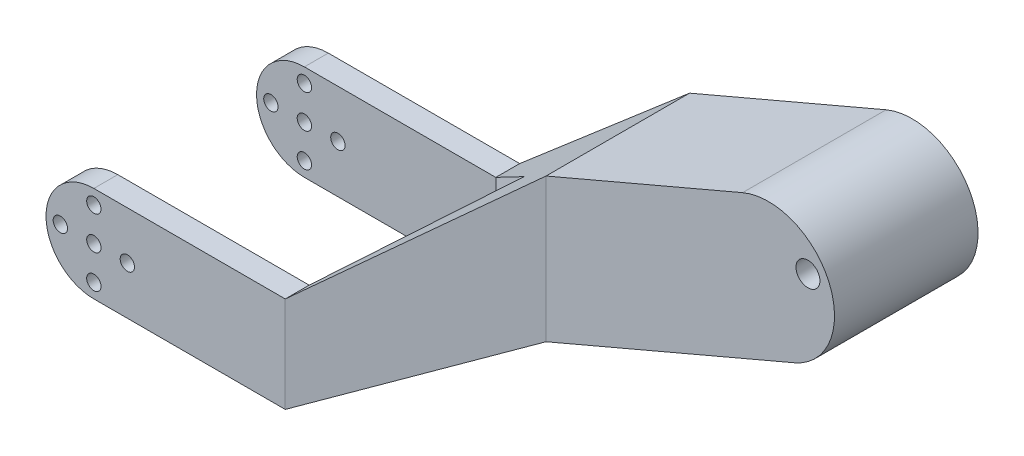
ISO-10303-21;
HEADER;
FILE_DESCRIPTION(('STEP AP214'),'2;1');
FILE_NAME('part.step','',(''),(''),'','','');
FILE_SCHEMA(('AUTOMOTIVE_DESIGN { 1 0 10303 214 1 1 1 1 }'));
ENDSEC;
DATA;
#1=APPLICATION_CONTEXT('core data for automotive mechanical design processes');
#2=APPLICATION_PROTOCOL_DEFINITION('international standard','automotive_design',2000,#1);
#3=PRODUCT_CONTEXT('',#1,'mechanical');
#4=PRODUCT('Part','Part','',(#3));
#5=PRODUCT_RELATED_PRODUCT_CATEGORY('part','',(#4));
#6=PRODUCT_DEFINITION_FORMATION('','',#4);
#7=PRODUCT_DEFINITION_CONTEXT('part definition',#1,'design');
#8=PRODUCT_DEFINITION('design','',#6,#7);
#9=PRODUCT_DEFINITION_SHAPE('','',#8);
#10=(LENGTH_UNIT() NAMED_UNIT(*) SI_UNIT(.MILLI.,.METRE.));
#11=(NAMED_UNIT(*) PLANE_ANGLE_UNIT() SI_UNIT($,.RADIAN.));
#12=(NAMED_UNIT(*) SI_UNIT($,.STERADIAN.) SOLID_ANGLE_UNIT());
#13=UNCERTAINTY_MEASURE_WITH_UNIT(LENGTH_MEASURE(1.E-05),#10,'distance_accuracy_value','');
#14=(GEOMETRIC_REPRESENTATION_CONTEXT(3) GLOBAL_UNCERTAINTY_ASSIGNED_CONTEXT((#13)) GLOBAL_UNIT_ASSIGNED_CONTEXT((#10,
#11,#12)) REPRESENTATION_CONTEXT('',''));
#15=CARTESIAN_POINT('',(0.,0.,0.));
#16=DIRECTION('',(0.,0.,1.));
#17=DIRECTION('',(1.,0.,0.));
#18=AXIS2_PLACEMENT_3D('',#15,#16,#17);
#19=CARTESIAN_POINT('',(-19.9999999999999,-7.,-44.));
#20=DIRECTION('',(0.,0.,1.));
#21=DIRECTION('',(1.,0.,0.));
#22=AXIS2_PLACEMENT_3D('',#19,#20,#21);
#23=CYLINDRICAL_SURFACE('',#22,1.5);
#24=CARTESIAN_POINT('',(-19.9999999999999,-7.,-44.));
#25=DIRECTION('',(0.,0.,-1.));
#26=DIRECTION('',(-1.,0.,0.));
#27=AXIS2_PLACEMENT_3D('',#24,#25,#26);
#28=CIRCLE('',#27,1.5);
#29=CARTESIAN_POINT('',(-21.4999999999999,-7.,-44.));
#30=VERTEX_POINT('',#29);
#31=EDGE_CURVE('E201',#30,#30,#28,.T.);
#32=ORIENTED_EDGE('',*,*,#31,.T.);
#33=EDGE_LOOP('',(#32));
#34=FACE_BOUND('',#33,.T.);
#35=CARTESIAN_POINT('',(-19.9999999999999,-7.,-39.));
#36=DIRECTION('',(0.,0.,-1.));
#37=DIRECTION('',(-1.,0.,0.));
#38=AXIS2_PLACEMENT_3D('',#35,#36,#37);
#39=CIRCLE('',#38,1.5);
#40=CARTESIAN_POINT('',(-21.4999999999999,-7.,-39.));
#41=VERTEX_POINT('',#40);
#42=EDGE_CURVE('E204',#41,#41,#39,.T.);
#43=ORIENTED_EDGE('',*,*,#42,.F.);
#44=EDGE_LOOP('',(#43));
#45=FACE_BOUND('',#44,.T.);
#46=ADVANCED_FACE('F61',(#34,#45),#23,.F.);
#47=CARTESIAN_POINT('',(-20.,7.,-44.));
#48=DIRECTION('',(0.,0.,1.));
#49=DIRECTION('',(1.,0.,0.));
#50=AXIS2_PLACEMENT_3D('',#47,#48,#49);
#51=CYLINDRICAL_SURFACE('',#50,1.5);
#52=CARTESIAN_POINT('',(-20.,7.,-44.));
#53=DIRECTION('',(0.,0.,-1.));
#54=DIRECTION('',(-1.,0.,0.));
#55=AXIS2_PLACEMENT_3D('',#52,#53,#54);
#56=CIRCLE('',#55,1.5);
#57=CARTESIAN_POINT('',(-21.5,7.,-44.));
#58=VERTEX_POINT('',#57);
#59=EDGE_CURVE('E189',#58,#58,#56,.T.);
#60=ORIENTED_EDGE('',*,*,#59,.T.);
#61=EDGE_LOOP('',(#60));
#62=FACE_BOUND('',#61,.T.);
#63=CARTESIAN_POINT('',(-20.,7.,-39.));
#64=DIRECTION('',(0.,0.,-1.));
#65=DIRECTION('',(-1.,0.,0.));
#66=AXIS2_PLACEMENT_3D('',#63,#64,#65);
#67=CIRCLE('',#66,1.5);
#68=CARTESIAN_POINT('',(-21.5,7.,-39.));
#69=VERTEX_POINT('',#68);
#70=EDGE_CURVE('E192',#69,#69,#67,.T.);
#71=ORIENTED_EDGE('',*,*,#70,.F.);
#72=EDGE_LOOP('',(#71));
#73=FACE_BOUND('',#72,.T.);
#74=ADVANCED_FACE('F413',(#62,#73),#51,.F.);
#75=CARTESIAN_POINT('',(-20.,0.,-44.));
#76=DIRECTION('',(0.,0.,1.));
#77=DIRECTION('',(1.,0.,0.));
#78=AXIS2_PLACEMENT_3D('',#75,#76,#77);
#79=CYLINDRICAL_SURFACE('',#78,1.5);
#80=CARTESIAN_POINT('',(-20.,0.,-44.));
#81=DIRECTION('',(0.,0.,-1.));
#82=DIRECTION('',(-1.,0.,0.));
#83=AXIS2_PLACEMENT_3D('',#80,#81,#82);
#84=CIRCLE('',#83,1.5);
#85=CARTESIAN_POINT('',(-21.5,0.,-44.));
#86=VERTEX_POINT('',#85);
#87=EDGE_CURVE('E183',#86,#86,#84,.T.);
#88=ORIENTED_EDGE('',*,*,#87,.T.);
#89=EDGE_LOOP('',(#88));
#90=FACE_BOUND('',#89,.T.);
#91=CARTESIAN_POINT('',(-20.,0.,-39.));
#92=DIRECTION('',(0.,0.,-1.));
#93=DIRECTION('',(-1.,0.,0.));
#94=AXIS2_PLACEMENT_3D('',#91,#92,#93);
#95=CIRCLE('',#94,1.5);
#96=CARTESIAN_POINT('',(-21.5,0.,-39.));
#97=VERTEX_POINT('',#96);
#98=EDGE_CURVE('E179',#97,#97,#95,.T.);
#99=ORIENTED_EDGE('',*,*,#98,.F.);
#100=EDGE_LOOP('',(#99));
#101=FACE_BOUND('',#100,.T.);
#102=ADVANCED_FACE('F419',(#90,#101),#79,.F.);
#103=CARTESIAN_POINT('',(-13.,0.,-44.));
#104=DIRECTION('',(0.,0.,1.));
#105=DIRECTION('',(1.,0.,0.));
#106=AXIS2_PLACEMENT_3D('',#103,#104,#105);
#107=CYLINDRICAL_SURFACE('',#106,1.5);
#108=CARTESIAN_POINT('',(-13.,0.,-44.));
#109=DIRECTION('',(0.,0.,-1.));
#110=DIRECTION('',(-1.,0.,0.));
#111=AXIS2_PLACEMENT_3D('',#108,#109,#110);
#112=CIRCLE('',#111,1.5);
#113=CARTESIAN_POINT('',(-14.5,0.,-44.));
#114=VERTEX_POINT('',#113);
#115=EDGE_CURVE('E182',#114,#114,#112,.T.);
#116=ORIENTED_EDGE('',*,*,#115,.T.);
#117=EDGE_LOOP('',(#116));
#118=FACE_BOUND('',#117,.T.);
#119=CARTESIAN_POINT('',(-13.,0.,-39.));
#120=DIRECTION('',(0.,0.,-1.));
#121=DIRECTION('',(-1.,0.,0.));
#122=AXIS2_PLACEMENT_3D('',#119,#120,#121);
#123=CIRCLE('',#122,1.5);
#124=CARTESIAN_POINT('',(-14.5,0.,-39.));
#125=VERTEX_POINT('',#124);
#126=EDGE_CURVE('E186',#125,#125,#123,.T.);
#127=ORIENTED_EDGE('',*,*,#126,.F.);
#128=EDGE_LOOP('',(#127));
#129=FACE_BOUND('',#128,.T.);
#130=ADVANCED_FACE('F480',(#118,#129),#107,.F.);
#131=CARTESIAN_POINT('',(-27.,0.,-44.));
#132=DIRECTION('',(0.,0.,1.));
#133=DIRECTION('',(1.,0.,0.));
#134=AXIS2_PLACEMENT_3D('',#131,#132,#133);
#135=CYLINDRICAL_SURFACE('',#134,1.5);
#136=CARTESIAN_POINT('',(-27.,0.,-44.));
#137=DIRECTION('',(0.,0.,-1.));
#138=DIRECTION('',(-1.,0.,0.));
#139=AXIS2_PLACEMENT_3D('',#136,#137,#138);
#140=CIRCLE('',#139,1.5);
#141=CARTESIAN_POINT('',(-28.5,0.,-44.));
#142=VERTEX_POINT('',#141);
#143=EDGE_CURVE('E195',#142,#142,#140,.T.);
#144=ORIENTED_EDGE('',*,*,#143,.T.);
#145=EDGE_LOOP('',(#144));
#146=FACE_BOUND('',#145,.T.);
#147=CARTESIAN_POINT('',(-27.,0.,-39.));
#148=DIRECTION('',(0.,0.,-1.));
#149=DIRECTION('',(-1.,0.,0.));
#150=AXIS2_PLACEMENT_3D('',#147,#148,#149);
#151=CIRCLE('',#150,1.5);
#152=CARTESIAN_POINT('',(-28.5,0.,-39.));
#153=VERTEX_POINT('',#152);
#154=EDGE_CURVE('E198',#153,#153,#151,.T.);
#155=ORIENTED_EDGE('',*,*,#154,.F.);
#156=EDGE_LOOP('',(#155));
#157=FACE_BOUND('',#156,.T.);
#158=ADVANCED_FACE('F425',(#146,#157),#135,.F.);
#159=CARTESIAN_POINT('',(-13.,0.,5.));
#160=DIRECTION('',(0.,0.,-1.));
#161=DIRECTION('',(-1.,0.,0.));
#162=AXIS2_PLACEMENT_3D('',#159,#160,#161);
#163=CYLINDRICAL_SURFACE('',#162,1.5);
#164=CARTESIAN_POINT('',(-13.,0.,5.));
#165=DIRECTION('',(0.,0.,1.));
#166=DIRECTION('',(1.,0.,0.));
#167=AXIS2_PLACEMENT_3D('',#164,#165,#166);
#168=CIRCLE('',#167,1.5);
#169=CARTESIAN_POINT('',(-11.5,0.,5.));
#170=VERTEX_POINT('',#169);
#171=EDGE_CURVE('E320',#170,#170,#168,.T.);
#172=ORIENTED_EDGE('',*,*,#171,.T.);
#173=EDGE_LOOP('',(#172));
#174=FACE_BOUND('',#173,.T.);
#175=CARTESIAN_POINT('',(-13.,0.,0.));
#176=DIRECTION('',(0.,0.,1.));
#177=DIRECTION('',(1.,0.,0.));
#178=AXIS2_PLACEMENT_3D('',#175,#176,#177);
#179=CIRCLE('',#178,1.5);
#180=CARTESIAN_POINT('',(-11.5,0.,0.));
#181=VERTEX_POINT('',#180);
#182=EDGE_CURVE('E267',#181,#181,#179,.T.);
#183=ORIENTED_EDGE('',*,*,#182,.F.);
#184=EDGE_LOOP('',(#183));
#185=FACE_BOUND('',#184,.T.);
#186=ADVANCED_FACE('F453',(#174,#185),#163,.F.);
#187=CARTESIAN_POINT('',(-27.,0.,5.));
#188=DIRECTION('',(0.,0.,-1.));
#189=DIRECTION('',(-1.,0.,0.));
#190=AXIS2_PLACEMENT_3D('',#187,#188,#189);
#191=CYLINDRICAL_SURFACE('',#190,1.5);
#192=CARTESIAN_POINT('',(-27.,0.,5.));
#193=DIRECTION('',(0.,0.,1.));
#194=DIRECTION('',(1.,0.,0.));
#195=AXIS2_PLACEMENT_3D('',#192,#193,#194);
#196=CIRCLE('',#195,1.5);
#197=CARTESIAN_POINT('',(-25.5,0.,5.));
#198=VERTEX_POINT('',#197);
#199=EDGE_CURVE('E308',#198,#198,#196,.T.);
#200=ORIENTED_EDGE('',*,*,#199,.T.);
#201=EDGE_LOOP('',(#200));
#202=FACE_BOUND('',#201,.T.);
#203=CARTESIAN_POINT('',(-27.,0.,0.));
#204=DIRECTION('',(0.,0.,1.));
#205=DIRECTION('',(1.,0.,0.));
#206=AXIS2_PLACEMENT_3D('',#203,#204,#205);
#207=CIRCLE('',#206,1.5);
#208=CARTESIAN_POINT('',(-25.5,0.,0.));
#209=VERTEX_POINT('',#208);
#210=EDGE_CURVE('E311',#209,#209,#207,.T.);
#211=ORIENTED_EDGE('',*,*,#210,.F.);
#212=EDGE_LOOP('',(#211));
#213=FACE_BOUND('',#212,.T.);
#214=ADVANCED_FACE('F504',(#202,#213),#191,.F.);
#215=CARTESIAN_POINT('',(-20.,0.,5.));
#216=DIRECTION('',(0.,0.,-1.));
#217=DIRECTION('',(-1.,0.,0.));
#218=AXIS2_PLACEMENT_3D('',#215,#216,#217);
#219=CYLINDRICAL_SURFACE('',#218,1.5);
#220=CARTESIAN_POINT('',(-20.,0.,5.));
#221=DIRECTION('',(0.,0.,1.));
#222=DIRECTION('',(1.,0.,0.));
#223=AXIS2_PLACEMENT_3D('',#220,#221,#222);
#224=CIRCLE('',#223,1.5);
#225=CARTESIAN_POINT('',(-18.5,0.,5.));
#226=VERTEX_POINT('',#225);
#227=EDGE_CURVE('E284',#226,#226,#224,.T.);
#228=ORIENTED_EDGE('',*,*,#227,.T.);
#229=EDGE_LOOP('',(#228));
#230=FACE_BOUND('',#229,.T.);
#231=CARTESIAN_POINT('',(-20.,0.,0.));
#232=DIRECTION('',(0.,0.,1.));
#233=DIRECTION('',(1.,0.,0.));
#234=AXIS2_PLACEMENT_3D('',#231,#232,#233);
#235=CIRCLE('',#234,1.5);
#236=CARTESIAN_POINT('',(-18.5,0.,0.));
#237=VERTEX_POINT('',#236);
#238=EDGE_CURVE('E299',#237,#237,#235,.T.);
#239=ORIENTED_EDGE('',*,*,#238,.F.);
#240=EDGE_LOOP('',(#239));
#241=FACE_BOUND('',#240,.T.);
#242=ADVANCED_FACE('F510',(#230,#241),#219,.F.);
#243=CARTESIAN_POINT('',(-20.,-7.,5.));
#244=DIRECTION('',(0.,0.,-1.));
#245=DIRECTION('',(-1.,0.,0.));
#246=AXIS2_PLACEMENT_3D('',#243,#244,#245);
#247=CYLINDRICAL_SURFACE('',#246,1.5);
#248=CARTESIAN_POINT('',(-20.,-7.,5.));
#249=DIRECTION('',(0.,0.,1.));
#250=DIRECTION('',(1.,0.,0.));
#251=AXIS2_PLACEMENT_3D('',#248,#249,#250);
#252=CIRCLE('',#251,1.5);
#253=CARTESIAN_POINT('',(-18.5,-7.,5.));
#254=VERTEX_POINT('',#253);
#255=EDGE_CURVE('E302',#254,#254,#252,.T.);
#256=ORIENTED_EDGE('',*,*,#255,.T.);
#257=EDGE_LOOP('',(#256));
#258=FACE_BOUND('',#257,.T.);
#259=CARTESIAN_POINT('',(-20.,-7.,0.));
#260=DIRECTION('',(0.,0.,1.));
#261=DIRECTION('',(1.,0.,0.));
#262=AXIS2_PLACEMENT_3D('',#259,#260,#261);
#263=CIRCLE('',#262,1.5);
#264=CARTESIAN_POINT('',(-18.5,-7.,0.));
#265=VERTEX_POINT('',#264);
#266=EDGE_CURVE('E305',#265,#265,#263,.T.);
#267=ORIENTED_EDGE('',*,*,#266,.F.);
#268=EDGE_LOOP('',(#267));
#269=FACE_BOUND('',#268,.T.);
#270=ADVANCED_FACE('F536',(#258,#269),#247,.F.);
#271=CARTESIAN_POINT('',(-19.9999999999999,7.,5.));
#272=DIRECTION('',(0.,0.,-1.));
#273=DIRECTION('',(-1.,0.,0.));
#274=AXIS2_PLACEMENT_3D('',#271,#272,#273);
#275=CYLINDRICAL_SURFACE('',#274,1.5);
#276=CARTESIAN_POINT('',(-19.9999999999999,7.,5.));
#277=DIRECTION('',(0.,0.,1.));
#278=DIRECTION('',(1.,0.,0.));
#279=AXIS2_PLACEMENT_3D('',#276,#277,#278);
#280=CIRCLE('',#279,1.5);
#281=CARTESIAN_POINT('',(-18.4999999999999,7.,5.));
#282=VERTEX_POINT('',#281);
#283=EDGE_CURVE('E314',#282,#282,#280,.T.);
#284=ORIENTED_EDGE('',*,*,#283,.T.);
#285=EDGE_LOOP('',(#284));
#286=FACE_BOUND('',#285,.T.);
#287=CARTESIAN_POINT('',(-19.9999999999999,7.,0.));
#288=DIRECTION('',(0.,0.,1.));
#289=DIRECTION('',(1.,0.,0.));
#290=AXIS2_PLACEMENT_3D('',#287,#288,#289);
#291=CIRCLE('',#290,1.5);
#292=CARTESIAN_POINT('',(-18.4999999999999,7.,0.));
#293=VERTEX_POINT('',#292);
#294=EDGE_CURVE('E317',#293,#293,#291,.T.);
#295=ORIENTED_EDGE('',*,*,#294,.F.);
#296=EDGE_LOOP('',(#295));
#297=FACE_BOUND('',#296,.T.);
#298=ADVANCED_FACE('F465',(#286,#297),#275,.F.);
#299=CARTESIAN_POINT('',(-20.,0.,-44.));
#300=DIRECTION('',(0.,0.,1.));
#301=DIRECTION('',(1.,0.,0.));
#302=AXIS2_PLACEMENT_3D('',#299,#300,#301);
#303=CYLINDRICAL_SURFACE('',#302,10.);
#304=CARTESIAN_POINT('',(-20.,0.,-39.));
#305=DIRECTION('',(0.,0.,-1.));
#306=DIRECTION('',(-1.,0.,0.));
#307=AXIS2_PLACEMENT_3D('',#304,#305,#306);
#308=CIRCLE('',#307,10.);
#309=CARTESIAN_POINT('',(-20.,-10.,-39.));
#310=VERTEX_POINT('',#309);
#311=CARTESIAN_POINT('',(-20.,10.,-39.));
#312=VERTEX_POINT('',#311);
#313=EDGE_CURVE('E178',#310,#312,#308,.T.);
#314=ORIENTED_EDGE('',*,*,#313,.T.);
#315=DIRECTION('',(0.,0.,1.));
#316=VECTOR('',#315,1.);
#317=CARTESIAN_POINT('',(-20.,10.,-44.));
#318=LINE('',#317,#316);
#319=CARTESIAN_POINT('',(-20.,10.,-44.));
#320=VERTEX_POINT('',#319);
#321=EDGE_CURVE('E170',#320,#312,#318,.T.);
#322=ORIENTED_EDGE('',*,*,#321,.F.);
#323=CARTESIAN_POINT('',(-20.,0.,-44.));
#324=DIRECTION('',(0.,0.,-1.));
#325=DIRECTION('',(-1.,0.,0.));
#326=AXIS2_PLACEMENT_3D('',#323,#324,#325);
#327=CIRCLE('',#326,10.);
#328=CARTESIAN_POINT('',(-20.,-10.,-44.));
#329=VERTEX_POINT('',#328);
#330=EDGE_CURVE('E151',#329,#320,#327,.T.);
#331=ORIENTED_EDGE('',*,*,#330,.F.);
#332=DIRECTION('',(0.,0.,1.));
#333=VECTOR('',#332,1.);
#334=CARTESIAN_POINT('',(-20.,-10.,-44.));
#335=LINE('',#334,#333);
#336=EDGE_CURVE('E157',#329,#310,#335,.T.);
#337=ORIENTED_EDGE('',*,*,#336,.T.);
#338=EDGE_LOOP('',(#314,#322,#331,#337));
#339=FACE_BOUND('',#338,.T.);
#340=ADVANCED_FACE('F168',(#339),#303,.T.);
#341=CARTESIAN_POINT('',(-20.,0.,-39.));
#342=DIRECTION('',(0.,0.,-1.));
#343=DIRECTION('',(-1.,0.,0.));
#344=AXIS2_PLACEMENT_3D('',#341,#342,#343);
#345=PLANE('',#344);
#346=ORIENTED_EDGE('',*,*,#313,.F.);
#347=DIRECTION('',(-1.,0.,0.));
#348=VECTOR('',#347,1.);
#349=CARTESIAN_POINT('',(20.,-10.,-39.));
#350=LINE('',#349,#348);
#351=CARTESIAN_POINT('',(20.,-10.,-39.));
#352=VERTEX_POINT('',#351);
#353=EDGE_CURVE('E162',#352,#310,#350,.T.);
#354=ORIENTED_EDGE('',*,*,#353,.F.);
#355=DIRECTION('',(0.,1.,0.));
#356=VECTOR('',#355,1.);
#357=CARTESIAN_POINT('',(20.,0.,-39.));
#358=LINE('',#357,#356);
#359=CARTESIAN_POINT('',(20.,10.,-39.));
#360=VERTEX_POINT('',#359);
#361=EDGE_CURVE('E173',#360,#352,#358,.F.);
#362=ORIENTED_EDGE('',*,*,#361,.F.);
#363=DIRECTION('',(1.,0.,0.));
#364=VECTOR('',#363,1.);
#365=CARTESIAN_POINT('',(20.,10.,-39.));
#366=LINE('',#365,#364);
#367=EDGE_CURVE('E349',#312,#360,#366,.T.);
#368=ORIENTED_EDGE('',*,*,#367,.F.);
#369=EDGE_LOOP('',(#346,#354,#362,#368));
#370=FACE_BOUND('',#369,.T.);
#371=ORIENTED_EDGE('',*,*,#98,.T.);
#372=EDGE_LOOP('',(#371));
#373=FACE_BOUND('',#372,.T.);
#374=ORIENTED_EDGE('',*,*,#126,.T.);
#375=EDGE_LOOP('',(#374));
#376=FACE_BOUND('',#375,.T.);
#377=ORIENTED_EDGE('',*,*,#70,.T.);
#378=EDGE_LOOP('',(#377));
#379=FACE_BOUND('',#378,.T.);
#380=ORIENTED_EDGE('',*,*,#154,.T.);
#381=EDGE_LOOP('',(#380));
#382=FACE_BOUND('',#381,.T.);
#383=ORIENTED_EDGE('',*,*,#42,.T.);
#384=EDGE_LOOP('',(#383));
#385=FACE_BOUND('',#384,.T.);
#386=ADVANCED_FACE('F359',(#370,#373,#376,#379,#382,#385),#345,.F.);
#387=CARTESIAN_POINT('',(-20.,0.,5.));
#388=DIRECTION('',(0.,0.,-1.));
#389=DIRECTION('',(-1.,0.,0.));
#390=AXIS2_PLACEMENT_3D('',#387,#388,#389);
#391=CYLINDRICAL_SURFACE('',#390,10.);
#392=CARTESIAN_POINT('',(-20.,0.,0.));
#393=DIRECTION('',(0.,0.,1.));
#394=DIRECTION('',(1.,0.,0.));
#395=AXIS2_PLACEMENT_3D('',#392,#393,#394);
#396=CIRCLE('',#395,10.);
#397=CARTESIAN_POINT('',(-20.,10.,0.));
#398=VERTEX_POINT('',#397);
#399=CARTESIAN_POINT('',(-20.,-10.,0.));
#400=VERTEX_POINT('',#399);
#401=EDGE_CURVE('E287',#398,#400,#396,.T.);
#402=ORIENTED_EDGE('',*,*,#401,.T.);
#403=DIRECTION('',(0.,0.,-1.));
#404=VECTOR('',#403,1.);
#405=CARTESIAN_POINT('',(-20.,-10.,5.));
#406=LINE('',#405,#404);
#407=CARTESIAN_POINT('',(-20.,-10.,5.));
#408=VERTEX_POINT('',#407);
#409=EDGE_CURVE('E280',#408,#400,#406,.T.);
#410=ORIENTED_EDGE('',*,*,#409,.F.);
#411=CARTESIAN_POINT('',(-20.,0.,5.));
#412=DIRECTION('',(0.,0.,1.));
#413=DIRECTION('',(1.,0.,0.));
#414=AXIS2_PLACEMENT_3D('',#411,#412,#413);
#415=CIRCLE('',#414,10.);
#416=CARTESIAN_POINT('',(-20.,10.,5.));
#417=VERTEX_POINT('',#416);
#418=EDGE_CURVE('E289',#417,#408,#415,.T.);
#419=ORIENTED_EDGE('',*,*,#418,.F.);
#420=DIRECTION('',(0.,0.,-1.));
#421=VECTOR('',#420,1.);
#422=CARTESIAN_POINT('',(-20.,10.,5.));
#423=LINE('',#422,#421);
#424=EDGE_CURVE('E270',#417,#398,#423,.T.);
#425=ORIENTED_EDGE('',*,*,#424,.T.);
#426=EDGE_LOOP('',(#402,#410,#419,#425));
#427=FACE_BOUND('',#426,.T.);
#428=ADVANCED_FACE('F474',(#427),#391,.T.);
#429=CARTESIAN_POINT('',(-20.,0.,0.));
#430=DIRECTION('',(0.,0.,1.));
#431=DIRECTION('',(1.,0.,0.));
#432=AXIS2_PLACEMENT_3D('',#429,#430,#431);
#433=PLANE('',#432);
#434=DIRECTION('',(0.,1.,0.));
#435=VECTOR('',#434,1.);
#436=CARTESIAN_POINT('',(20.,0.,0.));
#437=LINE('',#436,#435);
#438=CARTESIAN_POINT('',(20.,-10.,0.));
#439=VERTEX_POINT('',#438);
#440=CARTESIAN_POINT('',(20.,10.,0.));
#441=VERTEX_POINT('',#440);
#442=EDGE_CURVE('E281',#439,#441,#437,.T.);
#443=ORIENTED_EDGE('',*,*,#442,.F.);
#444=DIRECTION('',(1.,0.,0.));
#445=VECTOR('',#444,1.);
#446=CARTESIAN_POINT('',(-20.,-10.,0.));
#447=LINE('',#446,#445);
#448=EDGE_CURVE('E274',#400,#439,#447,.T.);
#449=ORIENTED_EDGE('',*,*,#448,.F.);
#450=ORIENTED_EDGE('',*,*,#401,.F.);
#451=DIRECTION('',(-1.,0.,0.));
#452=VECTOR('',#451,1.);
#453=CARTESIAN_POINT('',(-20.,10.,0.));
#454=LINE('',#453,#452);
#455=EDGE_CURVE('E285',#441,#398,#454,.T.);
#456=ORIENTED_EDGE('',*,*,#455,.F.);
#457=EDGE_LOOP('',(#443,#449,#450,#456));
#458=FACE_BOUND('',#457,.T.);
#459=ORIENTED_EDGE('',*,*,#238,.T.);
#460=EDGE_LOOP('',(#459));
#461=FACE_BOUND('',#460,.T.);
#462=ORIENTED_EDGE('',*,*,#266,.T.);
#463=EDGE_LOOP('',(#462));
#464=FACE_BOUND('',#463,.T.);
#465=ORIENTED_EDGE('',*,*,#210,.T.);
#466=EDGE_LOOP('',(#465));
#467=FACE_BOUND('',#466,.T.);
#468=ORIENTED_EDGE('',*,*,#294,.T.);
#469=EDGE_LOOP('',(#468));
#470=FACE_BOUND('',#469,.T.);
#471=ORIENTED_EDGE('',*,*,#182,.T.);
#472=EDGE_LOOP('',(#471));
#473=FACE_BOUND('',#472,.T.);
#474=ADVANCED_FACE('F517',(#458,#461,#464,#467,#470,#473),#433,.F.);
#475=CARTESIAN_POINT('',(-20.,10.,5.));
#476=DIRECTION('',(0.,-1.,0.));
#477=DIRECTION('',(0.,0.,-1.));
#478=AXIS2_PLACEMENT_3D('',#475,#476,#477);
#479=PLANE('',#478);
#480=ORIENTED_EDGE('',*,*,#455,.T.);
#481=ORIENTED_EDGE('',*,*,#424,.F.);
#482=DIRECTION('',(-1.,0.,0.));
#483=VECTOR('',#482,1.);
#484=CARTESIAN_POINT('',(-20.,10.,5.));
#485=LINE('',#484,#483);
#486=CARTESIAN_POINT('',(20.,10.,5.));
#487=VERTEX_POINT('',#486);
#488=EDGE_CURVE('E275',#487,#417,#485,.T.);
#489=ORIENTED_EDGE('',*,*,#488,.F.);
#490=DIRECTION('',(0.,0.,-1.));
#491=VECTOR('',#490,1.);
#492=CARTESIAN_POINT('',(20.,10.,5.));
#493=LINE('',#492,#491);
#494=EDGE_CURVE('E242',#487,#441,#493,.T.);
#495=ORIENTED_EDGE('',*,*,#494,.T.);
#496=EDGE_LOOP('',(#480,#481,#489,#495));
#497=FACE_BOUND('',#496,.T.);
#498=ADVANCED_FACE('F468',(#497),#479,.F.);
#499=CARTESIAN_POINT('',(20.,10.,-44.));
#500=DIRECTION('',(0.,-1.,0.));
#501=DIRECTION('',(0.,0.,-1.));
#502=AXIS2_PLACEMENT_3D('',#499,#500,#501);
#503=PLANE('',#502);
#504=ORIENTED_EDGE('',*,*,#367,.T.);
#505=DIRECTION('',(0.,0.,1.));
#506=VECTOR('',#505,1.);
#507=CARTESIAN_POINT('',(20.,10.,0.));
#508=LINE('',#507,#506);
#509=CARTESIAN_POINT('',(20.,10.,-44.));
#510=VERTEX_POINT('',#509);
#511=EDGE_CURVE('E344',#510,#360,#508,.T.);
#512=ORIENTED_EDGE('',*,*,#511,.F.);
#513=DIRECTION('',(1.,0.,0.));
#514=VECTOR('',#513,1.);
#515=CARTESIAN_POINT('',(20.,10.,-44.));
#516=LINE('',#515,#514);
#517=EDGE_CURVE('E171',#320,#510,#516,.T.);
#518=ORIENTED_EDGE('',*,*,#517,.F.);
#519=ORIENTED_EDGE('',*,*,#321,.T.);
#520=EDGE_LOOP('',(#504,#512,#518,#519));
#521=FACE_BOUND('',#520,.T.);
#522=ADVANCED_FACE('F355',(#521),#503,.F.);
#523=CARTESIAN_POINT('',(-20.,0.,-44.));
#524=DIRECTION('',(0.,0.,-1.));
#525=DIRECTION('',(-1.,0.,0.));
#526=AXIS2_PLACEMENT_3D('',#523,#524,#525);
#527=PLANE('',#526);
#528=ORIENTED_EDGE('',*,*,#143,.F.);
#529=EDGE_LOOP('',(#528));
#530=FACE_BOUND('',#529,.T.);
#531=ORIENTED_EDGE('',*,*,#115,.F.);
#532=EDGE_LOOP('',(#531));
#533=FACE_BOUND('',#532,.T.);
#534=ORIENTED_EDGE('',*,*,#330,.T.);
#535=ORIENTED_EDGE('',*,*,#517,.T.);
#536=DIRECTION('',(0.,1.,0.));
#537=VECTOR('',#536,1.);
#538=CARTESIAN_POINT('',(20.,0.,-44.));
#539=LINE('',#538,#537);
#540=CARTESIAN_POINT('',(20.,-9.99999999999999,-44.));
#541=VERTEX_POINT('',#540);
#542=EDGE_CURVE('E154',#510,#541,#539,.F.);
#543=ORIENTED_EDGE('',*,*,#542,.T.);
#544=DIRECTION('',(-1.,0.,0.));
#545=VECTOR('',#544,1.);
#546=CARTESIAN_POINT('',(20.,-10.,-44.));
#547=LINE('',#546,#545);
#548=EDGE_CURVE('E146',#541,#329,#547,.T.);
#549=ORIENTED_EDGE('',*,*,#548,.T.);
#550=EDGE_LOOP('',(#534,#535,#543,#549));
#551=FACE_BOUND('',#550,.T.);
#552=ORIENTED_EDGE('',*,*,#87,.F.);
#553=EDGE_LOOP('',(#552));
#554=FACE_BOUND('',#553,.T.);
#555=ORIENTED_EDGE('',*,*,#59,.F.);
#556=EDGE_LOOP('',(#555));
#557=FACE_BOUND('',#556,.T.);
#558=ORIENTED_EDGE('',*,*,#31,.F.);
#559=EDGE_LOOP('',(#558));
#560=FACE_BOUND('',#559,.T.);
#561=ADVANCED_FACE('F148',(#530,#533,#551,#554,#557,#560),#527,.T.);
#562=CARTESIAN_POINT('',(-20.,0.,5.));
#563=DIRECTION('',(0.,0.,1.));
#564=DIRECTION('',(1.,0.,0.));
#565=AXIS2_PLACEMENT_3D('',#562,#563,#564);
#566=PLANE('',#565);
#567=ORIENTED_EDGE('',*,*,#283,.F.);
#568=EDGE_LOOP('',(#567));
#569=FACE_BOUND('',#568,.T.);
#570=ORIENTED_EDGE('',*,*,#255,.F.);
#571=EDGE_LOOP('',(#570));
#572=FACE_BOUND('',#571,.T.);
#573=DIRECTION('',(0.,1.,0.));
#574=VECTOR('',#573,1.);
#575=CARTESIAN_POINT('',(20.,0.,5.));
#576=LINE('',#575,#574);
#577=CARTESIAN_POINT('',(20.,-10.,5.));
#578=VERTEX_POINT('',#577);
#579=EDGE_CURVE('E271',#578,#487,#576,.T.);
#580=ORIENTED_EDGE('',*,*,#579,.T.);
#581=ORIENTED_EDGE('',*,*,#488,.T.);
#582=ORIENTED_EDGE('',*,*,#418,.T.);
#583=DIRECTION('',(1.,0.,0.));
#584=VECTOR('',#583,1.);
#585=CARTESIAN_POINT('',(-20.,-10.,5.));
#586=LINE('',#585,#584);
#587=EDGE_CURVE('E279',#408,#578,#586,.T.);
#588=ORIENTED_EDGE('',*,*,#587,.T.);
#589=EDGE_LOOP('',(#580,#581,#582,#588));
#590=FACE_BOUND('',#589,.T.);
#591=ORIENTED_EDGE('',*,*,#227,.F.);
#592=EDGE_LOOP('',(#591));
#593=FACE_BOUND('',#592,.T.);
#594=ORIENTED_EDGE('',*,*,#199,.F.);
#595=EDGE_LOOP('',(#594));
#596=FACE_BOUND('',#595,.T.);
#597=ORIENTED_EDGE('',*,*,#171,.F.);
#598=EDGE_LOOP('',(#597));
#599=FACE_BOUND('',#598,.T.);
#600=ADVANCED_FACE('F471',(#569,#572,#590,#593,#596,#599),#566,.T.);
#601=CARTESIAN_POINT('',(20.,-10.,-44.));
#602=DIRECTION('',(0.,1.,0.));
#603=DIRECTION('',(0.,0.,1.));
#604=AXIS2_PLACEMENT_3D('',#601,#602,#603);
#605=PLANE('',#604);
#606=ORIENTED_EDGE('',*,*,#353,.T.);
#607=ORIENTED_EDGE('',*,*,#336,.F.);
#608=ORIENTED_EDGE('',*,*,#548,.F.);
#609=DIRECTION('',(0.,0.,1.));
#610=VECTOR('',#609,1.);
#611=CARTESIAN_POINT('',(20.,-10.,-44.));
#612=LINE('',#611,#610);
#613=EDGE_CURVE('E166',#541,#352,#612,.T.);
#614=ORIENTED_EDGE('',*,*,#613,.T.);
#615=EDGE_LOOP('',(#606,#607,#608,#614));
#616=FACE_BOUND('',#615,.T.);
#617=ADVANCED_FACE('F160',(#616),#605,.F.);
#618=CARTESIAN_POINT('',(26.2351294611616,0.,-34.2197340797761));
#619=DIRECTION('',(0.608431543657135,0.,-0.793606361291916));
#620=DIRECTION('',(-0.793606361291916,0.,-0.608431543657135));
#621=AXIS2_PLACEMENT_3D('',#618,#619,#620);
#622=PLANE('',#621);
#623=DIRECTION('',(0.701478560317433,0.467652373544956,0.537800229576699));
#624=VECTOR('',#623,1.);
#625=CARTESIAN_POINT('',(20.,-10.,-39.));
#626=LINE('',#625,#624);
#627=CARTESIAN_POINT('',(45.4347826086957,6.95652173913044,-19.5));
#628=VERTEX_POINT('',#627);
#629=EDGE_CURVE('E215',#352,#628,#626,.T.);
#630=ORIENTED_EDGE('',*,*,#629,.T.);
#631=DIRECTION('',(0.,1.,0.));
#632=VECTOR('',#631,1.);
#633=CARTESIAN_POINT('',(45.4347826086957,0.,-19.5));
#634=LINE('',#633,#632);
#635=CARTESIAN_POINT('',(45.4347826086957,32.6086956521739,-19.5));
#636=VERTEX_POINT('',#635);
#637=EDGE_CURVE('E330',#628,#636,#634,.T.);
#638=ORIENTED_EDGE('',*,*,#637,.T.);
#639=DIRECTION('',(0.648489716825975,0.576435303845311,0.49717544956658));
#640=VECTOR('',#639,1.);
#641=CARTESIAN_POINT('',(20.,10.,-39.));
#642=LINE('',#641,#640);
#643=EDGE_CURVE('E212',#360,#636,#642,.T.);
#644=ORIENTED_EDGE('',*,*,#643,.F.);
#645=ORIENTED_EDGE('',*,*,#361,.T.);
#646=EDGE_LOOP('',(#630,#638,#644,#645));
#647=FACE_BOUND('',#646,.T.);
#648=ADVANCED_FACE('F363',(#647),#622,.F.);
#649=CARTESIAN_POINT('',(7.4037788663401,0.,9.65710286913926));
#650=DIRECTION('',(0.608431543657136,0.,0.793606361291916));
#651=DIRECTION('',(0.793606361291916,0.,-0.608431543657136));
#652=AXIS2_PLACEMENT_3D('',#649,#650,#651);
#653=PLANE('',#652);
#654=ORIENTED_EDGE('',*,*,#637,.F.);
#655=DIRECTION('',(0.701478560317433,0.467652373544956,-0.537800229576699));
#656=VECTOR('',#655,1.);
#657=CARTESIAN_POINT('',(20.,-10.,0.));
#658=LINE('',#657,#656);
#659=EDGE_CURVE('E265',#439,#628,#658,.T.);
#660=ORIENTED_EDGE('',*,*,#659,.F.);
#661=ORIENTED_EDGE('',*,*,#442,.T.);
#662=DIRECTION('',(0.648489716825975,0.576435303845311,-0.497175449566581));
#663=VECTOR('',#662,1.);
#664=CARTESIAN_POINT('',(20.,10.,0.));
#665=LINE('',#664,#663);
#666=EDGE_CURVE('E331',#441,#636,#665,.T.);
#667=ORIENTED_EDGE('',*,*,#666,.T.);
#668=EDGE_LOOP('',(#654,#660,#661,#667));
#669=FACE_BOUND('',#668,.T.);
#670=ADVANCED_FACE('F370',(#669),#653,.F.);
#671=CARTESIAN_POINT('',(-20.,-10.,5.));
#672=DIRECTION('',(0.,1.,0.));
#673=DIRECTION('',(0.,0.,1.));
#674=AXIS2_PLACEMENT_3D('',#671,#672,#673);
#675=PLANE('',#674);
#676=ORIENTED_EDGE('',*,*,#448,.T.);
#677=DIRECTION('',(0.,0.,1.));
#678=VECTOR('',#677,1.);
#679=CARTESIAN_POINT('',(20.,-10.,0.));
#680=LINE('',#679,#678);
#681=EDGE_CURVE('E276',#578,#439,#680,.F.);
#682=ORIENTED_EDGE('',*,*,#681,.F.);
#683=ORIENTED_EDGE('',*,*,#587,.F.);
#684=ORIENTED_EDGE('',*,*,#409,.T.);
#685=EDGE_LOOP('',(#676,#682,#683,#684));
#686=FACE_BOUND('',#685,.T.);
#687=ADVANCED_FACE('F460',(#686),#675,.F.);
#688=CARTESIAN_POINT('',(3.86206896551724,-4.3448275862069,0.));
#689=DIRECTION('',(0.66436383882992,-0.74740931868366,0.));
#690=DIRECTION('',(0.74740931868366,0.66436383882992,0.));
#691=AXIS2_PLACEMENT_3D('',#688,#689,#690);
#692=PLANE('',#691);
#693=DIRECTION('',(0.,0.,1.));
#694=VECTOR('',#693,1.);
#695=CARTESIAN_POINT('',(65.,50.,-4.5));
#696=LINE('',#695,#694);
#697=CARTESIAN_POINT('',(65.,50.,-34.5));
#698=VERTEX_POINT('',#697);
#699=CARTESIAN_POINT('',(65.,50.,-4.5));
#700=VERTEX_POINT('',#699);
#701=EDGE_CURVE('E255',#698,#700,#696,.T.);
#702=ORIENTED_EDGE('',*,*,#701,.F.);
#703=DIRECTION('',(0.738275561100435,0.656244943200386,0.155858174010092));
#704=VECTOR('',#703,1.);
#705=CARTESIAN_POINT('',(20.,10.,-44.));
#706=LINE('',#705,#704);
#707=EDGE_CURVE('E207',#510,#698,#706,.T.);
#708=ORIENTED_EDGE('',*,*,#707,.F.);
#709=ORIENTED_EDGE('',*,*,#511,.T.);
#710=ORIENTED_EDGE('',*,*,#643,.T.);
#711=ORIENTED_EDGE('',*,*,#666,.F.);
#712=ORIENTED_EDGE('',*,*,#494,.F.);
#713=DIRECTION('',(0.738275561100435,0.656244943200386,-0.155858174010092));
#714=VECTOR('',#713,1.);
#715=CARTESIAN_POINT('',(20.,10.,5.));
#716=LINE('',#715,#714);
#717=EDGE_CURVE('E327',#487,#700,#716,.T.);
#718=ORIENTED_EDGE('',*,*,#717,.T.);
#719=EDGE_LOOP('',(#702,#708,#709,#710,#711,#712,#718));
#720=FACE_BOUND('',#719,.T.);
#721=ADVANCED_FACE('F374',(#720),#692,.F.);
#722=CARTESIAN_POINT('',(9.74589292045856,0.,-46.1647559390143));
#723=DIRECTION('',(-0.206558348887415,0.,0.978434284203546));
#724=DIRECTION('',(0.978434284203546,0.,0.206558348887415));
#725=AXIS2_PLACEMENT_3D('',#722,#723,#724);
#726=PLANE('',#725);
#727=ORIENTED_EDGE('',*,*,#707,.T.);
#728=DIRECTION('',(0.,-1.,0.));
#729=VECTOR('',#728,1.);
#730=CARTESIAN_POINT('',(65.,0.,-34.5));
#731=LINE('',#730,#729);
#732=CARTESIAN_POINT('',(64.9999999999999,20.,-34.5));
#733=VERTEX_POINT('',#732);
#734=EDGE_CURVE('E260',#733,#698,#731,.F.);
#735=ORIENTED_EDGE('',*,*,#734,.F.);
#736=DIRECTION('',(0.81950357166487,0.546335714443247,0.173006309573695));
#737=VECTOR('',#736,1.);
#738=CARTESIAN_POINT('',(20.,-10.,-44.));
#739=LINE('',#738,#737);
#740=EDGE_CURVE('E210',#541,#733,#739,.T.);
#741=ORIENTED_EDGE('',*,*,#740,.F.);
#742=ORIENTED_EDGE('',*,*,#542,.F.);
#743=EDGE_LOOP('',(#727,#735,#741,#742));
#744=FACE_BOUND('',#743,.T.);
#745=ADVANCED_FACE('F378',(#744),#726,.F.);
#746=CARTESIAN_POINT('',(1.86384588110153,0.,8.82874364732302));
#747=DIRECTION('',(-0.206558348887415,0.,-0.978434284203546));
#748=DIRECTION('',(-0.978434284203546,0.,0.206558348887416));
#749=AXIS2_PLACEMENT_3D('',#746,#747,#748);
#750=PLANE('',#749);
#751=DIRECTION('',(0.81950357166487,0.546335714443247,-0.173006309573695));
#752=VECTOR('',#751,1.);
#753=CARTESIAN_POINT('',(20.,-10.,5.));
#754=LINE('',#753,#752);
#755=CARTESIAN_POINT('',(64.9999999999999,20.,-4.5));
#756=VERTEX_POINT('',#755);
#757=EDGE_CURVE('E336',#578,#756,#754,.T.);
#758=ORIENTED_EDGE('',*,*,#757,.T.);
#759=DIRECTION('',(0.,1.,0.));
#760=VECTOR('',#759,1.);
#761=CARTESIAN_POINT('',(65.,0.,-4.50000000000001));
#762=LINE('',#761,#760);
#763=EDGE_CURVE('E252',#700,#756,#762,.F.);
#764=ORIENTED_EDGE('',*,*,#763,.F.);
#765=ORIENTED_EDGE('',*,*,#717,.F.);
#766=ORIENTED_EDGE('',*,*,#579,.F.);
#767=EDGE_LOOP('',(#758,#764,#765,#766));
#768=FACE_BOUND('',#767,.T.);
#769=ADVANCED_FACE('F428',(#768),#750,.F.);
#770=CARTESIAN_POINT('',(-8.03729884193112,18.8374191607761,0.));
#771=DIRECTION('',(0.392438685047783,-0.919778168080743,0.));
#772=DIRECTION('',(0.919778168080743,0.392438685047783,0.));
#773=AXIS2_PLACEMENT_3D('',#770,#771,#772);
#774=PLANE('',#773);
#775=DIRECTION('',(0.,0.,1.));
#776=VECTOR('',#775,1.);
#777=CARTESIAN_POINT('',(106.079345998317,67.5271876259486,-44.010025));
#778=LINE('',#777,#776);
#779=CARTESIAN_POINT('',(106.079345998317,67.5271876259486,-34.5));
#780=VERTEX_POINT('',#779);
#781=CARTESIAN_POINT('',(106.079345998317,67.5271876259486,-4.5));
#782=VERTEX_POINT('',#781);
#783=EDGE_CURVE('E231',#780,#782,#778,.T.);
#784=ORIENTED_EDGE('',*,*,#783,.F.);
#785=DIRECTION('',(0.919778168080743,0.392438685047783,0.));
#786=VECTOR('',#785,1.);
#787=CARTESIAN_POINT('',(65.,50.,-34.5));
#788=LINE('',#787,#786);
#789=EDGE_CURVE('E71',#698,#780,#788,.T.);
#790=ORIENTED_EDGE('',*,*,#789,.F.);
#791=ORIENTED_EDGE('',*,*,#701,.T.);
#792=DIRECTION('',(0.919778168080743,0.392438685047783,0.));
#793=VECTOR('',#792,1.);
#794=CARTESIAN_POINT('',(65.,50.,-4.5));
#795=LINE('',#794,#793);
#796=EDGE_CURVE('E12',#700,#782,#795,.T.);
#797=ORIENTED_EDGE('',*,*,#796,.T.);
#798=EDGE_LOOP('',(#784,#790,#791,#797));
#799=FACE_BOUND('',#798,.T.);
#800=ADVANCED_FACE('F397',(#799),#774,.F.);
#801=CARTESIAN_POINT('',(10.7692307692308,-16.1538461538462,0.));
#802=DIRECTION('',(-0.554700196225229,0.832050294337844,0.));
#803=DIRECTION('',(-0.832050294337844,-0.554700196225229,0.));
#804=AXIS2_PLACEMENT_3D('',#801,#802,#803);
#805=PLANE('',#804);
#806=DIRECTION('',(0.,0.,-1.));
#807=VECTOR('',#806,1.);
#808=CARTESIAN_POINT('',(65.,20.,-4.50000000000001));
#809=LINE('',#808,#807);
#810=EDGE_CURVE('E80',#756,#733,#809,.T.);
#811=ORIENTED_EDGE('',*,*,#810,.F.);
#812=ORIENTED_EDGE('',*,*,#757,.F.);
#813=ORIENTED_EDGE('',*,*,#681,.T.);
#814=ORIENTED_EDGE('',*,*,#659,.T.);
#815=ORIENTED_EDGE('',*,*,#629,.F.);
#816=ORIENTED_EDGE('',*,*,#613,.F.);
#817=ORIENTED_EDGE('',*,*,#740,.T.);
#818=EDGE_LOOP('',(#811,#812,#813,#814,#815,#816,#817));
#819=FACE_BOUND('',#818,.T.);
#820=ADVANCED_FACE('F365',(#819),#805,.F.);
#821=CARTESIAN_POINT('',(0.,0.,-4.50000000000001));
#822=DIRECTION('',(0.,0.,-1.));
#823=DIRECTION('',(0.,1.,0.));
#824=AXIS2_PLACEMENT_3D('',#821,#822,#823);
#825=PLANE('',#824);
#826=CARTESIAN_POINT('',(119.739276471741,59.6322403012692,-4.50000000000001));
#827=DIRECTION('',(0.,0.,1.));
#828=DIRECTION('',(1.,0.,0.));
#829=AXIS2_PLACEMENT_3D('',#826,#827,#828);
#830=CIRCLE('',#829,2.5);
#831=CARTESIAN_POINT('',(122.239276471741,59.6322403012692,-4.50000000000001));
#832=VERTEX_POINT('',#831);
#833=EDGE_CURVE('E442',#832,#832,#830,.T.);
#834=ORIENTED_EDGE('',*,*,#833,.F.);
#835=EDGE_LOOP('',(#834));
#836=FACE_BOUND('',#835,.T.);
#837=DIRECTION('',(0.919778168080743,0.392438685047783,0.));
#838=VECTOR('',#837,1.);
#839=CARTESIAN_POINT('',(65.,20.,-4.50000000000001));
#840=LINE('',#839,#838);
#841=CARTESIAN_POINT('',(116.908042042835,42.1474312716096,-4.5));
#842=VERTEX_POINT('',#841);
#843=EDGE_CURVE('E386',#756,#842,#840,.T.);
#844=ORIENTED_EDGE('',*,*,#843,.T.);
#845=CARTESIAN_POINT('',(111.493694020576,54.8373094487791,-4.5));
#846=DIRECTION('',(0.,0.,-1.));
#847=DIRECTION('',(0.,1.,0.));
#848=AXIS2_PLACEMENT_3D('',#845,#846,#847);
#849=CIRCLE('',#848,13.7966725212111);
#850=EDGE_CURVE('E244',#782,#842,#849,.T.);
#851=ORIENTED_EDGE('',*,*,#850,.F.);
#852=ORIENTED_EDGE('',*,*,#796,.F.);
#853=ORIENTED_EDGE('',*,*,#763,.T.);
#854=EDGE_LOOP('',(#844,#851,#852,#853));
#855=FACE_BOUND('',#854,.T.);
#856=ADVANCED_FACE('F63',(#836,#855),#825,.F.);
#857=CARTESIAN_POINT('',(0.,0.,-34.5));
#858=DIRECTION('',(0.,0.,1.));
#859=DIRECTION('',(0.,-1.,0.));
#860=AXIS2_PLACEMENT_3D('',#857,#858,#859);
#861=PLANE('',#860);
#862=CARTESIAN_POINT('',(119.739276471741,59.6322403012692,-34.5));
#863=DIRECTION('',(0.,0.,1.));
#864=DIRECTION('',(0.,-1.,0.));
#865=AXIS2_PLACEMENT_3D('',#862,#863,#864);
#866=CIRCLE('',#865,2.5);
#867=CARTESIAN_POINT('',(119.739276471741,57.1322403012692,-34.5));
#868=VERTEX_POINT('',#867);
#869=EDGE_CURVE('E65',#868,#868,#866,.T.);
#870=ORIENTED_EDGE('',*,*,#869,.T.);
#871=EDGE_LOOP('',(#870));
#872=FACE_BOUND('',#871,.T.);
#873=ORIENTED_EDGE('',*,*,#789,.T.);
#874=CARTESIAN_POINT('',(111.493694020576,54.8373094487791,-34.5));
#875=DIRECTION('',(0.,0.,1.));
#876=DIRECTION('',(0.,-1.,0.));
#877=AXIS2_PLACEMENT_3D('',#874,#875,#876);
#878=CIRCLE('',#877,13.7966725212111);
#879=CARTESIAN_POINT('',(116.908042042835,42.1474312716096,-34.5));
#880=VERTEX_POINT('',#879);
#881=EDGE_CURVE('E234',#880,#780,#878,.T.);
#882=ORIENTED_EDGE('',*,*,#881,.F.);
#883=DIRECTION('',(0.919778168080743,0.392438685047783,0.));
#884=VECTOR('',#883,1.);
#885=CARTESIAN_POINT('',(65.,20.,-34.5));
#886=LINE('',#885,#884);
#887=EDGE_CURVE('E217',#733,#880,#886,.T.);
#888=ORIENTED_EDGE('',*,*,#887,.F.);
#889=ORIENTED_EDGE('',*,*,#734,.T.);
#890=EDGE_LOOP('',(#873,#882,#888,#889));
#891=FACE_BOUND('',#890,.T.);
#892=ADVANCED_FACE('F389',(#872,#891),#861,.F.);
#893=CARTESIAN_POINT('',(2.79139720258685,-6.54233719356293,0.));
#894=DIRECTION('',(-0.392438685047783,0.919778168080743,0.));
#895=DIRECTION('',(-0.919778168080743,-0.392438685047783,0.));
#896=AXIS2_PLACEMENT_3D('',#893,#894,#895);
#897=PLANE('',#896);
#898=ORIENTED_EDGE('',*,*,#887,.T.);
#899=DIRECTION('',(0.,0.,1.));
#900=VECTOR('',#899,1.);
#901=CARTESIAN_POINT('',(116.908042042835,42.1474312716096,-44.010025));
#902=LINE('',#901,#900);
#903=EDGE_CURVE('E233',#880,#842,#902,.T.);
#904=ORIENTED_EDGE('',*,*,#903,.T.);
#905=ORIENTED_EDGE('',*,*,#843,.F.);
#906=ORIENTED_EDGE('',*,*,#810,.T.);
#907=EDGE_LOOP('',(#898,#904,#905,#906));
#908=FACE_BOUND('',#907,.T.);
#909=ADVANCED_FACE('F383',(#908),#897,.F.);
#910=CARTESIAN_POINT('',(111.493694020576,54.8373094487791,-44.010025));
#911=DIRECTION('',(0.,0.,1.));
#912=DIRECTION('',(1.,0.,0.));
#913=AXIS2_PLACEMENT_3D('',#910,#911,#912);
#914=CYLINDRICAL_SURFACE('',#913,13.7966725212111);
#915=ORIENTED_EDGE('',*,*,#881,.T.);
#916=ORIENTED_EDGE('',*,*,#783,.T.);
#917=ORIENTED_EDGE('',*,*,#850,.T.);
#918=ORIENTED_EDGE('',*,*,#903,.F.);
#919=EDGE_LOOP('',(#915,#916,#917,#918));
#920=FACE_BOUND('',#919,.T.);
#921=ADVANCED_FACE('F400',(#920),#914,.T.);
#922=CARTESIAN_POINT('',(119.739276471741,59.6322403012692,-44.000025));
#923=DIRECTION('',(0.,0.,1.));
#924=DIRECTION('',(1.,0.,0.));
#925=AXIS2_PLACEMENT_3D('',#922,#923,#924);
#926=CYLINDRICAL_SURFACE('',#925,2.5);
#927=ORIENTED_EDGE('',*,*,#833,.T.);
#928=EDGE_LOOP('',(#927));
#929=FACE_BOUND('',#928,.T.);
#930=ORIENTED_EDGE('',*,*,#869,.F.);
#931=EDGE_LOOP('',(#930));
#932=FACE_BOUND('',#931,.T.);
#933=ADVANCED_FACE('F403',(#929,#932),#926,.F.);
#934=CLOSED_SHELL('',(#46,#74,#102,#130,#158,#186,#214,#242,#270,#298,#340,#386,#428,#474,#498,
#522,#561,#600,#617,#648,#670,#687,#721,#745,#769,#800,#820,#856,#892,#909,#921,#933));
#935=MANIFOLD_SOLID_BREP('B2',#934);
#936=ADVANCED_BREP_SHAPE_REPRESENTATION('',(#18,#935),#14);
#937=SHAPE_DEFINITION_REPRESENTATION(#9,#936);
ENDSEC;
END-ISO-10303-21;
